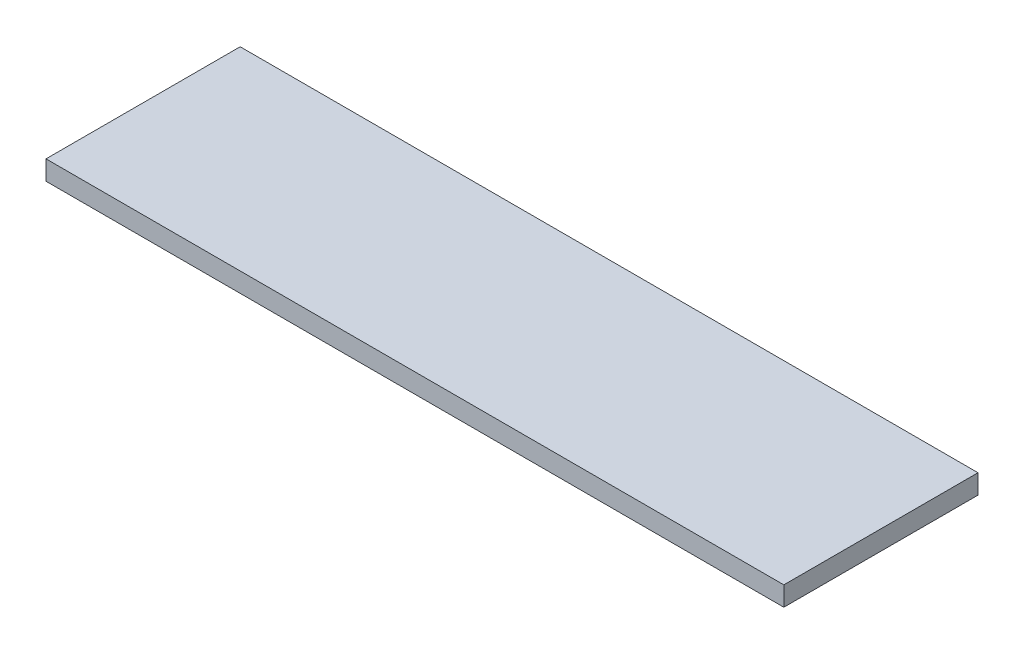
ISO-10303-21;
HEADER;
FILE_DESCRIPTION(('STEP AP214'),'2;1');
FILE_NAME('part.step','',(''),(''),'','','');
FILE_SCHEMA(('AUTOMOTIVE_DESIGN { 1 0 10303 214 1 1 1 1 }'));
ENDSEC;
DATA;
#1=APPLICATION_CONTEXT('core data for automotive mechanical design processes');
#2=APPLICATION_PROTOCOL_DEFINITION('international standard','automotive_design',2000,#1);
#3=PRODUCT_CONTEXT('',#1,'mechanical');
#4=PRODUCT('Part','Part','',(#3));
#5=PRODUCT_RELATED_PRODUCT_CATEGORY('part','',(#4));
#6=PRODUCT_DEFINITION_FORMATION('','',#4);
#7=PRODUCT_DEFINITION_CONTEXT('part definition',#1,'design');
#8=PRODUCT_DEFINITION('design','',#6,#7);
#9=PRODUCT_DEFINITION_SHAPE('','',#8);
#10=(LENGTH_UNIT() NAMED_UNIT(*) SI_UNIT(.MILLI.,.METRE.));
#11=(NAMED_UNIT(*) PLANE_ANGLE_UNIT() SI_UNIT($,.RADIAN.));
#12=(NAMED_UNIT(*) SI_UNIT($,.STERADIAN.) SOLID_ANGLE_UNIT());
#13=UNCERTAINTY_MEASURE_WITH_UNIT(LENGTH_MEASURE(1.E-05),#10,'distance_accuracy_value','');
#14=(GEOMETRIC_REPRESENTATION_CONTEXT(3) GLOBAL_UNCERTAINTY_ASSIGNED_CONTEXT((#13)) GLOBAL_UNIT_ASSIGNED_CONTEXT((#10,
#11,#12)) REPRESENTATION_CONTEXT('',''));
#15=CARTESIAN_POINT('',(0.,0.,0.));
#16=DIRECTION('',(0.,0.,1.));
#17=DIRECTION('',(1.,0.,0.));
#18=AXIS2_PLACEMENT_3D('',#15,#16,#17);
#19=CARTESIAN_POINT('',(0.,3.175,0.));
#20=DIRECTION('',(1.,0.,0.));
#21=DIRECTION('',(0.,0.,-1.));
#22=AXIS2_PLACEMENT_3D('',#19,#20,#21);
#23=PLANE('',#22);
#24=DIRECTION('',(0.,0.,1.));
#25=VECTOR('',#24,1.);
#26=CARTESIAN_POINT('',(0.,0.,0.));
#27=LINE('',#26,#25);
#28=CARTESIAN_POINT('',(0.,0.,-31.75));
#29=VERTEX_POINT('',#28);
#30=CARTESIAN_POINT('',(0.,0.,0.));
#31=VERTEX_POINT('',#30);
#32=EDGE_CURVE('E96',#29,#31,#27,.T.);
#33=ORIENTED_EDGE('',*,*,#32,.T.);
#34=DIRECTION('',(0.,-1.,0.));
#35=VECTOR('',#34,1.);
#36=CARTESIAN_POINT('',(0.,3.175,0.));
#37=LINE('',#36,#35);
#38=CARTESIAN_POINT('',(0.,3.175,0.));
#39=VERTEX_POINT('',#38);
#40=EDGE_CURVE('E11',#39,#31,#37,.T.);
#41=ORIENTED_EDGE('',*,*,#40,.F.);
#42=DIRECTION('',(0.,0.,1.));
#43=VECTOR('',#42,1.);
#44=CARTESIAN_POINT('',(0.,3.175,0.));
#45=LINE('',#44,#43);
#46=CARTESIAN_POINT('',(0.,3.175,-31.75));
#47=VERTEX_POINT('',#46);
#48=EDGE_CURVE('E84',#47,#39,#45,.T.);
#49=ORIENTED_EDGE('',*,*,#48,.F.);
#50=DIRECTION('',(0.,-1.,0.));
#51=VECTOR('',#50,1.);
#52=CARTESIAN_POINT('',(0.,3.175,-31.75));
#53=LINE('',#52,#51);
#54=EDGE_CURVE('E92',#47,#29,#53,.T.);
#55=ORIENTED_EDGE('',*,*,#54,.T.);
#56=EDGE_LOOP('',(#33,#41,#49,#55));
#57=FACE_BOUND('',#56,.T.);
#58=ADVANCED_FACE('F33',(#57),#23,.F.);
#59=CARTESIAN_POINT('',(0.,3.175,0.));
#60=DIRECTION('',(0.,0.,-1.));
#61=DIRECTION('',(-1.,0.,0.));
#62=AXIS2_PLACEMENT_3D('',#59,#60,#61);
#63=PLANE('',#62);
#64=DIRECTION('',(1.,0.,0.));
#65=VECTOR('',#64,1.);
#66=CARTESIAN_POINT('',(0.,0.,0.));
#67=LINE('',#66,#65);
#68=CARTESIAN_POINT('',(120.65,0.,0.));
#69=VERTEX_POINT('',#68);
#70=EDGE_CURVE('E88',#31,#69,#67,.T.);
#71=ORIENTED_EDGE('',*,*,#70,.T.);
#72=DIRECTION('',(0.,-1.,0.));
#73=VECTOR('',#72,1.);
#74=CARTESIAN_POINT('',(120.65,3.175,0.));
#75=LINE('',#74,#73);
#76=CARTESIAN_POINT('',(120.65,3.175,0.));
#77=VERTEX_POINT('',#76);
#78=EDGE_CURVE('E41',#77,#69,#75,.T.);
#79=ORIENTED_EDGE('',*,*,#78,.F.);
#80=DIRECTION('',(1.,0.,0.));
#81=VECTOR('',#80,1.);
#82=CARTESIAN_POINT('',(0.,3.175,0.));
#83=LINE('',#82,#81);
#84=EDGE_CURVE('E79',#39,#77,#83,.T.);
#85=ORIENTED_EDGE('',*,*,#84,.F.);
#86=ORIENTED_EDGE('',*,*,#40,.T.);
#87=EDGE_LOOP('',(#71,#79,#85,#86));
#88=FACE_BOUND('',#87,.T.);
#89=ADVANCED_FACE('F87',(#88),#63,.F.);
#90=CARTESIAN_POINT('',(120.65,3.175,0.));
#91=DIRECTION('',(-1.,0.,0.));
#92=DIRECTION('',(0.,0.,1.));
#93=AXIS2_PLACEMENT_3D('',#90,#91,#92);
#94=PLANE('',#93);
#95=DIRECTION('',(0.,0.,-1.));
#96=VECTOR('',#95,1.);
#97=CARTESIAN_POINT('',(120.65,0.,0.));
#98=LINE('',#97,#96);
#99=CARTESIAN_POINT('',(120.65,0.,-31.75));
#100=VERTEX_POINT('',#99);
#101=EDGE_CURVE('E66',#69,#100,#98,.T.);
#102=ORIENTED_EDGE('',*,*,#101,.T.);
#103=DIRECTION('',(0.,-1.,0.));
#104=VECTOR('',#103,1.);
#105=CARTESIAN_POINT('',(120.65,3.175,-31.75));
#106=LINE('',#105,#104);
#107=CARTESIAN_POINT('',(120.65,3.175,-31.75));
#108=VERTEX_POINT('',#107);
#109=EDGE_CURVE('E89',#108,#100,#106,.T.);
#110=ORIENTED_EDGE('',*,*,#109,.F.);
#111=DIRECTION('',(0.,0.,-1.));
#112=VECTOR('',#111,1.);
#113=CARTESIAN_POINT('',(120.65,3.175,0.));
#114=LINE('',#113,#112);
#115=EDGE_CURVE('E82',#77,#108,#114,.T.);
#116=ORIENTED_EDGE('',*,*,#115,.F.);
#117=ORIENTED_EDGE('',*,*,#78,.T.);
#118=EDGE_LOOP('',(#102,#110,#116,#117));
#119=FACE_BOUND('',#118,.T.);
#120=ADVANCED_FACE('F90',(#119),#94,.F.);
#121=CARTESIAN_POINT('',(0.,3.175,-31.75));
#122=DIRECTION('',(0.,0.,1.));
#123=DIRECTION('',(1.,0.,0.));
#124=AXIS2_PLACEMENT_3D('',#121,#122,#123);
#125=PLANE('',#124);
#126=DIRECTION('',(-1.,0.,0.));
#127=VECTOR('',#126,1.);
#128=CARTESIAN_POINT('',(0.,0.,-31.75));
#129=LINE('',#128,#127);
#130=EDGE_CURVE('E72',#100,#29,#129,.T.);
#131=ORIENTED_EDGE('',*,*,#130,.T.);
#132=ORIENTED_EDGE('',*,*,#54,.F.);
#133=DIRECTION('',(-1.,0.,0.));
#134=VECTOR('',#133,1.);
#135=CARTESIAN_POINT('',(0.,3.175,-31.75));
#136=LINE('',#135,#134);
#137=EDGE_CURVE('E49',#108,#47,#136,.T.);
#138=ORIENTED_EDGE('',*,*,#137,.F.);
#139=ORIENTED_EDGE('',*,*,#109,.T.);
#140=EDGE_LOOP('',(#131,#132,#138,#139));
#141=FACE_BOUND('',#140,.T.);
#142=ADVANCED_FACE('F103',(#141),#125,.F.);
#143=CARTESIAN_POINT('',(0.,3.175,0.));
#144=DIRECTION('',(0.,-1.,0.));
#145=DIRECTION('',(0.,0.,-1.));
#146=AXIS2_PLACEMENT_3D('',#143,#144,#145);
#147=PLANE('',#146);
#148=ORIENTED_EDGE('',*,*,#48,.T.);
#149=ORIENTED_EDGE('',*,*,#84,.T.);
#150=ORIENTED_EDGE('',*,*,#115,.T.);
#151=ORIENTED_EDGE('',*,*,#137,.T.);
#152=EDGE_LOOP('',(#148,#149,#150,#151));
#153=FACE_BOUND('',#152,.T.);
#154=ADVANCED_FACE('F80',(#153),#147,.F.);
#155=CARTESIAN_POINT('',(0.,0.,0.));
#156=DIRECTION('',(0.,-1.,0.));
#157=DIRECTION('',(0.,0.,-1.));
#158=AXIS2_PLACEMENT_3D('',#155,#156,#157);
#159=PLANE('',#158);
#160=ORIENTED_EDGE('',*,*,#32,.F.);
#161=ORIENTED_EDGE('',*,*,#130,.F.);
#162=ORIENTED_EDGE('',*,*,#101,.F.);
#163=ORIENTED_EDGE('',*,*,#70,.F.);
#164=EDGE_LOOP('',(#160,#161,#162,#163));
#165=FACE_BOUND('',#164,.T.);
#166=ADVANCED_FACE('F106',(#165),#159,.T.);
#167=CLOSED_SHELL('',(#58,#89,#120,#142,#154,#166));
#168=MANIFOLD_SOLID_BREP('B2',#167);
#169=ADVANCED_BREP_SHAPE_REPRESENTATION('',(#18,#168),#14);
#170=SHAPE_DEFINITION_REPRESENTATION(#9,#169);
ENDSEC;
END-ISO-10303-21;
